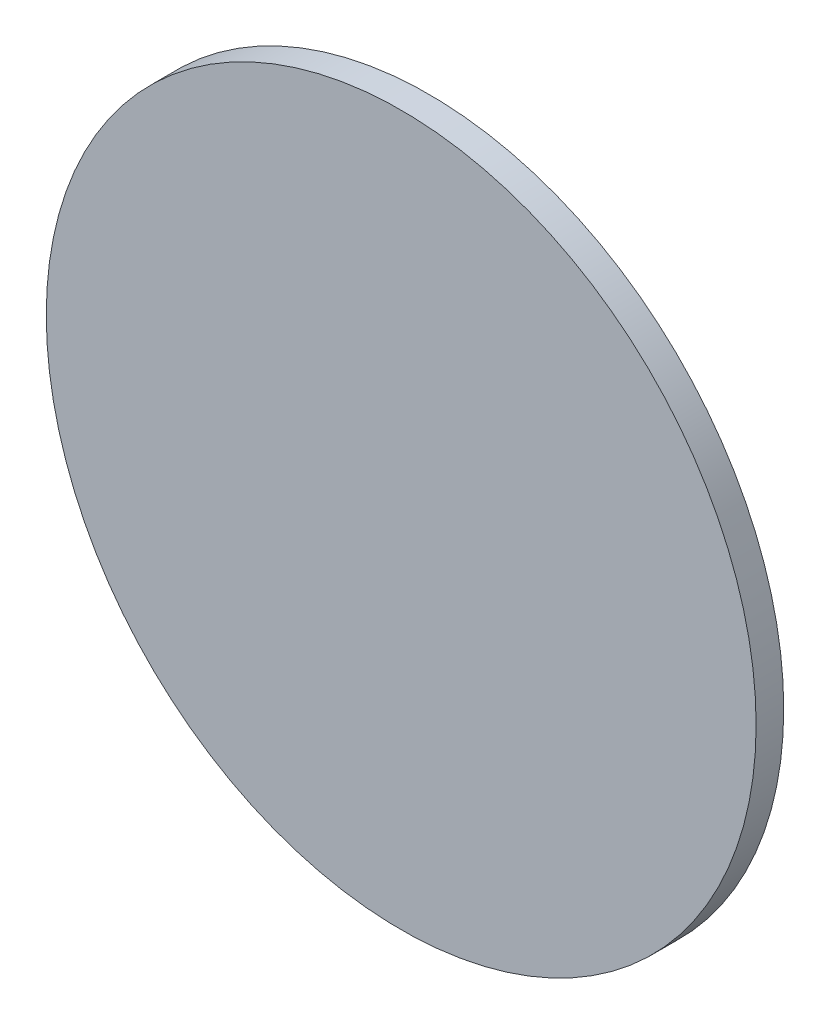
ISO-10303-21;
HEADER;
FILE_DESCRIPTION(('STEP AP214'),'2;1');
FILE_NAME('part.step','',(''),(''),'','','');
FILE_SCHEMA(('AUTOMOTIVE_DESIGN { 1 0 10303 214 1 1 1 1 }'));
ENDSEC;
DATA;
#1=APPLICATION_CONTEXT('core data for automotive mechanical design processes');
#2=APPLICATION_PROTOCOL_DEFINITION('international standard','automotive_design',2000,#1);
#3=PRODUCT_CONTEXT('',#1,'mechanical');
#4=PRODUCT('Part','Part','',(#3));
#5=PRODUCT_RELATED_PRODUCT_CATEGORY('part','',(#4));
#6=PRODUCT_DEFINITION_FORMATION('','',#4);
#7=PRODUCT_DEFINITION_CONTEXT('part definition',#1,'design');
#8=PRODUCT_DEFINITION('design','',#6,#7);
#9=PRODUCT_DEFINITION_SHAPE('','',#8);
#10=(LENGTH_UNIT() NAMED_UNIT(*) SI_UNIT(.MILLI.,.METRE.));
#11=(NAMED_UNIT(*) PLANE_ANGLE_UNIT() SI_UNIT($,.RADIAN.));
#12=(NAMED_UNIT(*) SI_UNIT($,.STERADIAN.) SOLID_ANGLE_UNIT());
#13=UNCERTAINTY_MEASURE_WITH_UNIT(LENGTH_MEASURE(1.E-05),#10,'distance_accuracy_value','');
#14=(GEOMETRIC_REPRESENTATION_CONTEXT(3) GLOBAL_UNCERTAINTY_ASSIGNED_CONTEXT((#13)) GLOBAL_UNIT_ASSIGNED_CONTEXT((#10,
#11,#12)) REPRESENTATION_CONTEXT('',''));
#15=CARTESIAN_POINT('',(0.,0.,0.));
#16=DIRECTION('',(0.,0.,1.));
#17=DIRECTION('',(1.,0.,0.));
#18=AXIS2_PLACEMENT_3D('',#15,#16,#17);
#19=CARTESIAN_POINT('',(0.,0.,3.5));
#20=DIRECTION('',(0.,0.,-1.));
#21=DIRECTION('',(-1.,0.,0.));
#22=AXIS2_PLACEMENT_3D('',#19,#20,#21);
#23=CYLINDRICAL_SURFACE('',#22,45.);
#24=CARTESIAN_POINT('',(0.,0.,3.5));
#25=DIRECTION('',(0.,0.,1.));
#26=DIRECTION('',(1.,0.,0.));
#27=AXIS2_PLACEMENT_3D('',#24,#25,#26);
#28=CIRCLE('',#27,45.);
#29=CARTESIAN_POINT('',(45.,0.,3.5));
#30=VERTEX_POINT('',#29);
#31=EDGE_CURVE('E10',#30,#30,#28,.T.);
#32=ORIENTED_EDGE('',*,*,#31,.F.);
#33=EDGE_LOOP('',(#32));
#34=FACE_BOUND('',#33,.T.);
#35=CARTESIAN_POINT('',(0.,0.,0.));
#36=DIRECTION('',(0.,0.,1.));
#37=DIRECTION('',(1.,0.,0.));
#38=AXIS2_PLACEMENT_3D('',#35,#36,#37);
#39=CIRCLE('',#38,45.);
#40=CARTESIAN_POINT('',(45.,0.,0.));
#41=VERTEX_POINT('',#40);
#42=EDGE_CURVE('E37',#41,#41,#39,.T.);
#43=ORIENTED_EDGE('',*,*,#42,.T.);
#44=EDGE_LOOP('',(#43));
#45=FACE_BOUND('',#44,.T.);
#46=ADVANCED_FACE('F34',(#34,#45),#23,.T.);
#47=CARTESIAN_POINT('',(0.,0.,3.5));
#48=DIRECTION('',(0.,0.,1.));
#49=DIRECTION('',(1.,0.,0.));
#50=AXIS2_PLACEMENT_3D('',#47,#48,#49);
#51=PLANE('',#50);
#52=ORIENTED_EDGE('',*,*,#31,.T.);
#53=EDGE_LOOP('',(#52));
#54=FACE_BOUND('',#53,.T.);
#55=ADVANCED_FACE('F49',(#54),#51,.T.);
#56=CARTESIAN_POINT('',(0.,0.,0.));
#57=DIRECTION('',(0.,0.,1.));
#58=DIRECTION('',(1.,0.,0.));
#59=AXIS2_PLACEMENT_3D('',#56,#57,#58);
#60=PLANE('',#59);
#61=ORIENTED_EDGE('',*,*,#42,.F.);
#62=EDGE_LOOP('',(#61));
#63=FACE_BOUND('',#62,.T.);
#64=ADVANCED_FACE('F47',(#63),#60,.F.);
#65=CLOSED_SHELL('',(#46,#55,#64));
#66=MANIFOLD_SOLID_BREP('B2',#65);
#67=ADVANCED_BREP_SHAPE_REPRESENTATION('',(#18,#66),#14);
#68=SHAPE_DEFINITION_REPRESENTATION(#9,#67);
ENDSEC;
END-ISO-10303-21;
